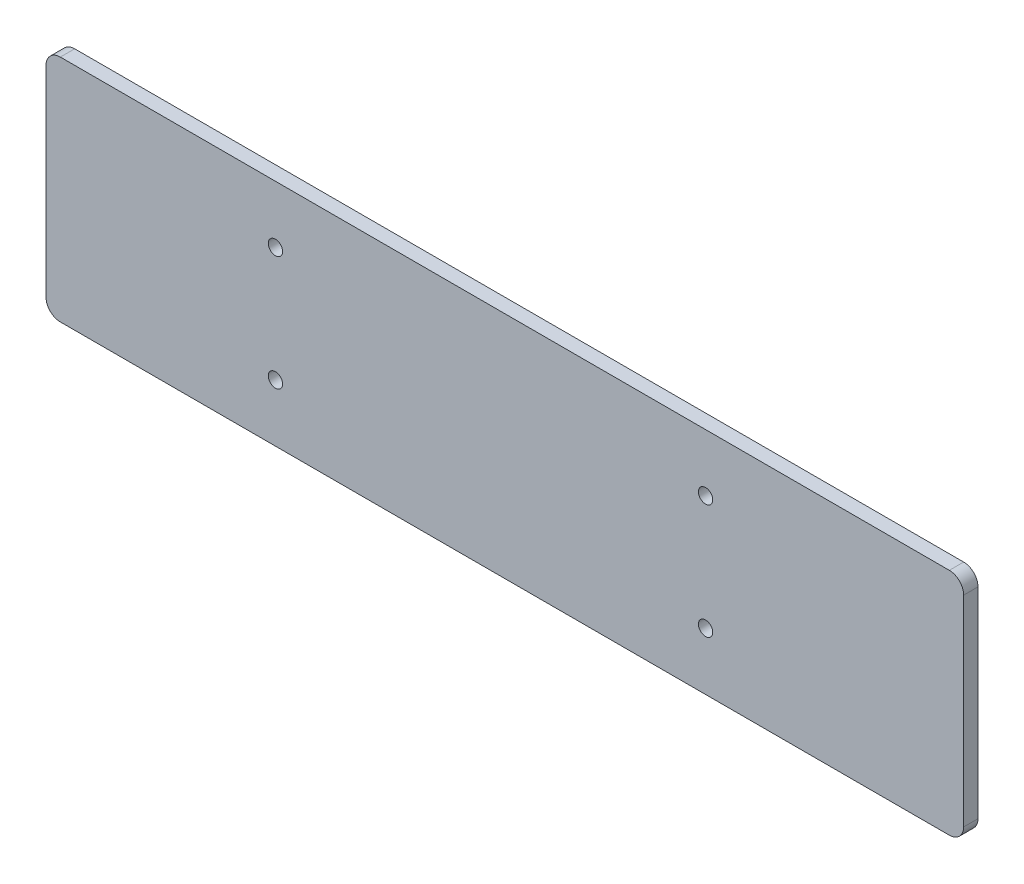
ISO-10303-21;
HEADER;
FILE_DESCRIPTION(('STEP AP214'),'2;1');
FILE_NAME('part.step','',(''),(''),'','','');
FILE_SCHEMA(('AUTOMOTIVE_DESIGN { 1 0 10303 214 1 1 1 1 }'));
ENDSEC;
DATA;
#1=APPLICATION_CONTEXT('core data for automotive mechanical design processes');
#2=APPLICATION_PROTOCOL_DEFINITION('international standard','automotive_design',2000,#1);
#3=PRODUCT_CONTEXT('',#1,'mechanical');
#4=PRODUCT('Part','Part','',(#3));
#5=PRODUCT_RELATED_PRODUCT_CATEGORY('part','',(#4));
#6=PRODUCT_DEFINITION_FORMATION('','',#4);
#7=PRODUCT_DEFINITION_CONTEXT('part definition',#1,'design');
#8=PRODUCT_DEFINITION('design','',#6,#7);
#9=PRODUCT_DEFINITION_SHAPE('','',#8);
#10=(LENGTH_UNIT() NAMED_UNIT(*) SI_UNIT(.MILLI.,.METRE.));
#11=(NAMED_UNIT(*) PLANE_ANGLE_UNIT() SI_UNIT($,.RADIAN.));
#12=(NAMED_UNIT(*) SI_UNIT($,.STERADIAN.) SOLID_ANGLE_UNIT());
#13=UNCERTAINTY_MEASURE_WITH_UNIT(LENGTH_MEASURE(1.E-05),#10,'distance_accuracy_value','');
#14=(GEOMETRIC_REPRESENTATION_CONTEXT(3) GLOBAL_UNCERTAINTY_ASSIGNED_CONTEXT((#13)) GLOBAL_UNIT_ASSIGNED_CONTEXT((#10,
#11,#12)) REPRESENTATION_CONTEXT('',''));
#15=CARTESIAN_POINT('',(0.,0.,0.));
#16=DIRECTION('',(0.,0.,1.));
#17=DIRECTION('',(1.,0.,0.));
#18=AXIS2_PLACEMENT_3D('',#15,#16,#17);
#19=CARTESIAN_POINT('',(0.,0.,5.));
#20=DIRECTION('',(0.,0.,1.));
#21=DIRECTION('',(1.,0.,0.));
#22=AXIS2_PLACEMENT_3D('',#19,#20,#21);
#23=PLANE('',#22);
#24=CARTESIAN_POINT('',(20.,20.,5.));
#25=DIRECTION('',(0.,0.,1.));
#26=DIRECTION('',(1.,0.,0.));
#27=AXIS2_PLACEMENT_3D('',#24,#25,#26);
#28=CIRCLE('',#27,2.49999999999999);
#29=CARTESIAN_POINT('',(22.5,20.,5.));
#30=VERTEX_POINT('',#29);
#31=EDGE_CURVE('E191',#30,#30,#28,.T.);
#32=ORIENTED_EDGE('',*,*,#31,.F.);
#33=EDGE_LOOP('',(#32));
#34=FACE_BOUND('',#33,.T.);
#35=CARTESIAN_POINT('',(-130.,-20.,5.));
#36=DIRECTION('',(0.,0.,1.));
#37=DIRECTION('',(1.,0.,0.));
#38=AXIS2_PLACEMENT_3D('',#35,#36,#37);
#39=CIRCLE('',#38,2.5);
#40=CARTESIAN_POINT('',(-127.5,-20.,5.));
#41=VERTEX_POINT('',#40);
#42=EDGE_CURVE('E134',#41,#41,#39,.T.);
#43=ORIENTED_EDGE('',*,*,#42,.F.);
#44=EDGE_LOOP('',(#43));
#45=FACE_BOUND('',#44,.T.);
#46=DIRECTION('',(0.,-1.,0.));
#47=VECTOR('',#46,1.);
#48=CARTESIAN_POINT('',(-210.,-40.,5.));
#49=LINE('',#48,#47);
#50=CARTESIAN_POINT('',(-210.,35.,5.));
#51=VERTEX_POINT('',#50);
#52=CARTESIAN_POINT('',(-210.,-35.,5.));
#53=VERTEX_POINT('',#52);
#54=EDGE_CURVE('E139',#51,#53,#49,.T.);
#55=ORIENTED_EDGE('',*,*,#54,.T.);
#56=CARTESIAN_POINT('',(-205.,-35.,5.));
#57=DIRECTION('',(0.,0.,1.));
#58=DIRECTION('',(1.,0.,0.));
#59=AXIS2_PLACEMENT_3D('',#56,#57,#58);
#60=CIRCLE('',#59,5.);
#61=CARTESIAN_POINT('',(-205.,-40.,5.));
#62=VERTEX_POINT('',#61);
#63=EDGE_CURVE('E153',#53,#62,#60,.T.);
#64=ORIENTED_EDGE('',*,*,#63,.T.);
#65=DIRECTION('',(1.,0.,0.));
#66=VECTOR('',#65,1.);
#67=CARTESIAN_POINT('',(110.,-40.,5.));
#68=LINE('',#67,#66);
#69=CARTESIAN_POINT('',(105.,-40.,5.));
#70=VERTEX_POINT('',#69);
#71=EDGE_CURVE('E120',#62,#70,#68,.T.);
#72=ORIENTED_EDGE('',*,*,#71,.T.);
#73=CARTESIAN_POINT('',(105.,-35.,5.));
#74=DIRECTION('',(0.,0.,1.));
#75=DIRECTION('',(1.,0.,0.));
#76=AXIS2_PLACEMENT_3D('',#73,#74,#75);
#77=CIRCLE('',#76,5.);
#78=CARTESIAN_POINT('',(110.,-35.,5.));
#79=VERTEX_POINT('',#78);
#80=EDGE_CURVE('E149',#70,#79,#77,.T.);
#81=ORIENTED_EDGE('',*,*,#80,.T.);
#82=DIRECTION('',(0.,1.,0.));
#83=VECTOR('',#82,1.);
#84=CARTESIAN_POINT('',(110.,-40.,5.));
#85=LINE('',#84,#83);
#86=CARTESIAN_POINT('',(110.,35.,5.));
#87=VERTEX_POINT('',#86);
#88=EDGE_CURVE('E162',#79,#87,#85,.T.);
#89=ORIENTED_EDGE('',*,*,#88,.T.);
#90=CARTESIAN_POINT('',(105.,35.,5.));
#91=DIRECTION('',(0.,0.,1.));
#92=DIRECTION('',(1.,0.,0.));
#93=AXIS2_PLACEMENT_3D('',#90,#91,#92);
#94=CIRCLE('',#93,5.);
#95=CARTESIAN_POINT('',(105.,40.,5.));
#96=VERTEX_POINT('',#95);
#97=EDGE_CURVE('E55',#87,#96,#94,.T.);
#98=ORIENTED_EDGE('',*,*,#97,.T.);
#99=DIRECTION('',(-1.,0.,0.));
#100=VECTOR('',#99,1.);
#101=CARTESIAN_POINT('',(110.,40.,5.));
#102=LINE('',#101,#100);
#103=CARTESIAN_POINT('',(-205.,40.,5.));
#104=VERTEX_POINT('',#103);
#105=EDGE_CURVE('E140',#96,#104,#102,.T.);
#106=ORIENTED_EDGE('',*,*,#105,.T.);
#107=CARTESIAN_POINT('',(-205.,35.,5.));
#108=DIRECTION('',(0.,0.,1.));
#109=DIRECTION('',(1.,0.,0.));
#110=AXIS2_PLACEMENT_3D('',#107,#108,#109);
#111=CIRCLE('',#110,5.);
#112=EDGE_CURVE('E151',#104,#51,#111,.T.);
#113=ORIENTED_EDGE('',*,*,#112,.T.);
#114=EDGE_LOOP('',(#55,#64,#72,#81,#89,#98,#106,#113));
#115=FACE_BOUND('',#114,.T.);
#116=CARTESIAN_POINT('',(-130.,20.,5.));
#117=DIRECTION('',(0.,0.,1.));
#118=DIRECTION('',(1.,0.,0.));
#119=AXIS2_PLACEMENT_3D('',#116,#117,#118);
#120=CIRCLE('',#119,2.5);
#121=CARTESIAN_POINT('',(-127.5,20.,5.));
#122=VERTEX_POINT('',#121);
#123=EDGE_CURVE('E185',#122,#122,#120,.T.);
#124=ORIENTED_EDGE('',*,*,#123,.F.);
#125=EDGE_LOOP('',(#124));
#126=FACE_BOUND('',#125,.T.);
#127=CARTESIAN_POINT('',(20.,-20.,5.));
#128=DIRECTION('',(0.,0.,1.));
#129=DIRECTION('',(1.,0.,0.));
#130=AXIS2_PLACEMENT_3D('',#127,#128,#129);
#131=CIRCLE('',#130,2.49999999999999);
#132=CARTESIAN_POINT('',(22.5,-20.,5.));
#133=VERTEX_POINT('',#132);
#134=EDGE_CURVE('E197',#133,#133,#131,.T.);
#135=ORIENTED_EDGE('',*,*,#134,.F.);
#136=EDGE_LOOP('',(#135));
#137=FACE_BOUND('',#136,.T.);
#138=ADVANCED_FACE('F33',(#34,#45,#115,#126,#137),#23,.T.);
#139=CARTESIAN_POINT('',(0.,0.,0.));
#140=DIRECTION('',(0.,0.,1.));
#141=DIRECTION('',(1.,0.,0.));
#142=AXIS2_PLACEMENT_3D('',#139,#140,#141);
#143=PLANE('',#142);
#144=DIRECTION('',(1.,0.,0.));
#145=VECTOR('',#144,1.);
#146=CARTESIAN_POINT('',(110.,-40.,0.));
#147=LINE('',#146,#145);
#148=CARTESIAN_POINT('',(-205.,-40.,0.));
#149=VERTEX_POINT('',#148);
#150=CARTESIAN_POINT('',(105.,-40.,0.));
#151=VERTEX_POINT('',#150);
#152=EDGE_CURVE('E117',#149,#151,#147,.T.);
#153=ORIENTED_EDGE('',*,*,#152,.F.);
#154=CARTESIAN_POINT('',(-205.,-35.,0.));
#155=DIRECTION('',(0.,0.,1.));
#156=DIRECTION('',(1.,0.,0.));
#157=AXIS2_PLACEMENT_3D('',#154,#155,#156);
#158=CIRCLE('',#157,5.);
#159=CARTESIAN_POINT('',(-210.,-35.,0.));
#160=VERTEX_POINT('',#159);
#161=EDGE_CURVE('E100',#149,#160,#158,.F.);
#162=ORIENTED_EDGE('',*,*,#161,.T.);
#163=DIRECTION('',(0.,-1.,0.));
#164=VECTOR('',#163,1.);
#165=CARTESIAN_POINT('',(-210.,-40.,0.));
#166=LINE('',#165,#164);
#167=CARTESIAN_POINT('',(-210.,35.,0.));
#168=VERTEX_POINT('',#167);
#169=EDGE_CURVE('E129',#168,#160,#166,.T.);
#170=ORIENTED_EDGE('',*,*,#169,.F.);
#171=CARTESIAN_POINT('',(-205.,35.,0.));
#172=DIRECTION('',(0.,0.,1.));
#173=DIRECTION('',(1.,0.,0.));
#174=AXIS2_PLACEMENT_3D('',#171,#172,#173);
#175=CIRCLE('',#174,5.);
#176=CARTESIAN_POINT('',(-205.,40.,0.));
#177=VERTEX_POINT('',#176);
#178=EDGE_CURVE('E111',#168,#177,#175,.F.);
#179=ORIENTED_EDGE('',*,*,#178,.T.);
#180=DIRECTION('',(-1.,0.,0.));
#181=VECTOR('',#180,1.);
#182=CARTESIAN_POINT('',(110.,40.,0.));
#183=LINE('',#182,#181);
#184=CARTESIAN_POINT('',(105.,40.,0.));
#185=VERTEX_POINT('',#184);
#186=EDGE_CURVE('E132',#185,#177,#183,.T.);
#187=ORIENTED_EDGE('',*,*,#186,.F.);
#188=CARTESIAN_POINT('',(105.,35.,0.));
#189=DIRECTION('',(0.,0.,1.));
#190=DIRECTION('',(1.,0.,0.));
#191=AXIS2_PLACEMENT_3D('',#188,#189,#190);
#192=CIRCLE('',#191,5.);
#193=CARTESIAN_POINT('',(110.,35.,0.));
#194=VERTEX_POINT('',#193);
#195=EDGE_CURVE('E121',#185,#194,#192,.F.);
#196=ORIENTED_EDGE('',*,*,#195,.T.);
#197=DIRECTION('',(0.,1.,0.));
#198=VECTOR('',#197,1.);
#199=CARTESIAN_POINT('',(110.,-40.,0.));
#200=LINE('',#199,#198);
#201=CARTESIAN_POINT('',(110.,-35.,0.));
#202=VERTEX_POINT('',#201);
#203=EDGE_CURVE('E128',#202,#194,#200,.T.);
#204=ORIENTED_EDGE('',*,*,#203,.F.);
#205=CARTESIAN_POINT('',(105.,-35.,0.));
#206=DIRECTION('',(0.,0.,1.));
#207=DIRECTION('',(1.,0.,0.));
#208=AXIS2_PLACEMENT_3D('',#205,#206,#207);
#209=CIRCLE('',#208,5.);
#210=EDGE_CURVE('E127',#202,#151,#209,.F.);
#211=ORIENTED_EDGE('',*,*,#210,.T.);
#212=EDGE_LOOP('',(#153,#162,#170,#179,#187,#196,#204,#211));
#213=FACE_BOUND('',#212,.T.);
#214=CARTESIAN_POINT('',(-130.,-20.,0.));
#215=DIRECTION('',(0.,0.,1.));
#216=DIRECTION('',(1.,0.,0.));
#217=AXIS2_PLACEMENT_3D('',#214,#215,#216);
#218=CIRCLE('',#217,2.5);
#219=CARTESIAN_POINT('',(-127.5,-20.,0.));
#220=VERTEX_POINT('',#219);
#221=EDGE_CURVE('E182',#220,#220,#218,.T.);
#222=ORIENTED_EDGE('',*,*,#221,.T.);
#223=EDGE_LOOP('',(#222));
#224=FACE_BOUND('',#223,.T.);
#225=CARTESIAN_POINT('',(-130.,20.,0.));
#226=DIRECTION('',(0.,0.,1.));
#227=DIRECTION('',(1.,0.,0.));
#228=AXIS2_PLACEMENT_3D('',#225,#226,#227);
#229=CIRCLE('',#228,2.5);
#230=CARTESIAN_POINT('',(-127.5,20.,0.));
#231=VERTEX_POINT('',#230);
#232=EDGE_CURVE('E188',#231,#231,#229,.T.);
#233=ORIENTED_EDGE('',*,*,#232,.T.);
#234=EDGE_LOOP('',(#233));
#235=FACE_BOUND('',#234,.T.);
#236=CARTESIAN_POINT('',(20.,20.,0.));
#237=DIRECTION('',(0.,0.,1.));
#238=DIRECTION('',(1.,0.,0.));
#239=AXIS2_PLACEMENT_3D('',#236,#237,#238);
#240=CIRCLE('',#239,2.49999999999999);
#241=CARTESIAN_POINT('',(22.5,20.,0.));
#242=VERTEX_POINT('',#241);
#243=EDGE_CURVE('E194',#242,#242,#240,.T.);
#244=ORIENTED_EDGE('',*,*,#243,.T.);
#245=EDGE_LOOP('',(#244));
#246=FACE_BOUND('',#245,.T.);
#247=CARTESIAN_POINT('',(20.,-20.,0.));
#248=DIRECTION('',(0.,0.,1.));
#249=DIRECTION('',(1.,0.,0.));
#250=AXIS2_PLACEMENT_3D('',#247,#248,#249);
#251=CIRCLE('',#250,2.49999999999999);
#252=CARTESIAN_POINT('',(22.5,-20.,0.));
#253=VERTEX_POINT('',#252);
#254=EDGE_CURVE('E200',#253,#253,#251,.T.);
#255=ORIENTED_EDGE('',*,*,#254,.T.);
#256=EDGE_LOOP('',(#255));
#257=FACE_BOUND('',#256,.T.);
#258=ADVANCED_FACE('F124',(#213,#224,#235,#246,#257),#143,.F.);
#259=CARTESIAN_POINT('',(-210.,-40.,5.));
#260=DIRECTION('',(1.,0.,0.));
#261=DIRECTION('',(0.,0.,-1.));
#262=AXIS2_PLACEMENT_3D('',#259,#260,#261);
#263=PLANE('',#262);
#264=ORIENTED_EDGE('',*,*,#169,.T.);
#265=DIRECTION('',(0.,0.,-1.));
#266=VECTOR('',#265,1.);
#267=CARTESIAN_POINT('',(-210.,-35.,5.));
#268=LINE('',#267,#266);
#269=EDGE_CURVE('E105',#160,#53,#268,.F.);
#270=ORIENTED_EDGE('',*,*,#269,.T.);
#271=ORIENTED_EDGE('',*,*,#54,.F.);
#272=DIRECTION('',(0.,0.,-1.));
#273=VECTOR('',#272,1.);
#274=CARTESIAN_POINT('',(-210.,35.,5.));
#275=LINE('',#274,#273);
#276=EDGE_CURVE('E110',#51,#168,#275,.T.);
#277=ORIENTED_EDGE('',*,*,#276,.T.);
#278=EDGE_LOOP('',(#264,#270,#271,#277));
#279=FACE_BOUND('',#278,.T.);
#280=ADVANCED_FACE('F178',(#279),#263,.F.);
#281=CARTESIAN_POINT('',(110.,-40.,5.));
#282=DIRECTION('',(0.,1.,0.));
#283=DIRECTION('',(-1.,0.,0.));
#284=AXIS2_PLACEMENT_3D('',#281,#282,#283);
#285=PLANE('',#284);
#286=ORIENTED_EDGE('',*,*,#71,.F.);
#287=DIRECTION('',(0.,0.,-1.));
#288=VECTOR('',#287,1.);
#289=CARTESIAN_POINT('',(-205.,-40.,5.));
#290=LINE('',#289,#288);
#291=EDGE_CURVE('E104',#62,#149,#290,.T.);
#292=ORIENTED_EDGE('',*,*,#291,.T.);
#293=ORIENTED_EDGE('',*,*,#152,.T.);
#294=DIRECTION('',(0.,0.,-1.));
#295=VECTOR('',#294,1.);
#296=CARTESIAN_POINT('',(105.,-40.,5.));
#297=LINE('',#296,#295);
#298=EDGE_CURVE('E122',#151,#70,#297,.F.);
#299=ORIENTED_EDGE('',*,*,#298,.T.);
#300=EDGE_LOOP('',(#286,#292,#293,#299));
#301=FACE_BOUND('',#300,.T.);
#302=ADVANCED_FACE('F116',(#301),#285,.F.);
#303=CARTESIAN_POINT('',(110.,-40.,5.));
#304=DIRECTION('',(-1.,0.,0.));
#305=DIRECTION('',(0.,0.,1.));
#306=AXIS2_PLACEMENT_3D('',#303,#304,#305);
#307=PLANE('',#306);
#308=ORIENTED_EDGE('',*,*,#88,.F.);
#309=DIRECTION('',(0.,0.,-1.));
#310=VECTOR('',#309,1.);
#311=CARTESIAN_POINT('',(110.,-35.,5.));
#312=LINE('',#311,#310);
#313=EDGE_CURVE('E11',#79,#202,#312,.T.);
#314=ORIENTED_EDGE('',*,*,#313,.T.);
#315=ORIENTED_EDGE('',*,*,#203,.T.);
#316=DIRECTION('',(0.,0.,-1.));
#317=VECTOR('',#316,1.);
#318=CARTESIAN_POINT('',(110.,35.,5.));
#319=LINE('',#318,#317);
#320=EDGE_CURVE('E41',#194,#87,#319,.F.);
#321=ORIENTED_EDGE('',*,*,#320,.T.);
#322=EDGE_LOOP('',(#308,#314,#315,#321));
#323=FACE_BOUND('',#322,.T.);
#324=ADVANCED_FACE('F161',(#323),#307,.F.);
#325=CARTESIAN_POINT('',(110.,40.,5.));
#326=DIRECTION('',(0.,-1.,0.));
#327=DIRECTION('',(1.,0.,0.));
#328=AXIS2_PLACEMENT_3D('',#325,#326,#327);
#329=PLANE('',#328);
#330=ORIENTED_EDGE('',*,*,#186,.T.);
#331=DIRECTION('',(0.,0.,-1.));
#332=VECTOR('',#331,1.);
#333=CARTESIAN_POINT('',(-205.,40.,5.));
#334=LINE('',#333,#332);
#335=EDGE_CURVE('E48',#177,#104,#334,.F.);
#336=ORIENTED_EDGE('',*,*,#335,.T.);
#337=ORIENTED_EDGE('',*,*,#105,.F.);
#338=DIRECTION('',(0.,0.,-1.));
#339=VECTOR('',#338,1.);
#340=CARTESIAN_POINT('',(105.,40.,5.));
#341=LINE('',#340,#339);
#342=EDGE_CURVE('E155',#96,#185,#341,.T.);
#343=ORIENTED_EDGE('',*,*,#342,.T.);
#344=EDGE_LOOP('',(#330,#336,#337,#343));
#345=FACE_BOUND('',#344,.T.);
#346=ADVANCED_FACE('F171',(#345),#329,.F.);
#347=CARTESIAN_POINT('',(-130.,-20.,5.));
#348=DIRECTION('',(0.,0.,-1.));
#349=DIRECTION('',(-1.,0.,0.));
#350=AXIS2_PLACEMENT_3D('',#347,#348,#349);
#351=CYLINDRICAL_SURFACE('',#350,2.5);
#352=ORIENTED_EDGE('',*,*,#42,.T.);
#353=EDGE_LOOP('',(#352));
#354=FACE_BOUND('',#353,.T.);
#355=ORIENTED_EDGE('',*,*,#221,.F.);
#356=EDGE_LOOP('',(#355));
#357=FACE_BOUND('',#356,.T.);
#358=ADVANCED_FACE('F219',(#354,#357),#351,.F.);
#359=CARTESIAN_POINT('',(-130.,20.,5.));
#360=DIRECTION('',(0.,0.,-1.));
#361=DIRECTION('',(-1.,0.,0.));
#362=AXIS2_PLACEMENT_3D('',#359,#360,#361);
#363=CYLINDRICAL_SURFACE('',#362,2.5);
#364=ORIENTED_EDGE('',*,*,#123,.T.);
#365=EDGE_LOOP('',(#364));
#366=FACE_BOUND('',#365,.T.);
#367=ORIENTED_EDGE('',*,*,#232,.F.);
#368=EDGE_LOOP('',(#367));
#369=FACE_BOUND('',#368,.T.);
#370=ADVANCED_FACE('F311',(#366,#369),#363,.F.);
#371=CARTESIAN_POINT('',(20.,20.,5.));
#372=DIRECTION('',(0.,0.,-1.));
#373=DIRECTION('',(-1.,0.,0.));
#374=AXIS2_PLACEMENT_3D('',#371,#372,#373);
#375=CYLINDRICAL_SURFACE('',#374,2.49999999999999);
#376=ORIENTED_EDGE('',*,*,#31,.T.);
#377=EDGE_LOOP('',(#376));
#378=FACE_BOUND('',#377,.T.);
#379=ORIENTED_EDGE('',*,*,#243,.F.);
#380=EDGE_LOOP('',(#379));
#381=FACE_BOUND('',#380,.T.);
#382=ADVANCED_FACE('F302',(#378,#381),#375,.F.);
#383=CARTESIAN_POINT('',(20.,-20.,5.));
#384=DIRECTION('',(0.,0.,-1.));
#385=DIRECTION('',(-1.,0.,0.));
#386=AXIS2_PLACEMENT_3D('',#383,#384,#385);
#387=CYLINDRICAL_SURFACE('',#386,2.49999999999999);
#388=ORIENTED_EDGE('',*,*,#134,.T.);
#389=EDGE_LOOP('',(#388));
#390=FACE_BOUND('',#389,.T.);
#391=ORIENTED_EDGE('',*,*,#254,.F.);
#392=EDGE_LOOP('',(#391));
#393=FACE_BOUND('',#392,.T.);
#394=ADVANCED_FACE('F206',(#390,#393),#387,.F.);
#395=CARTESIAN_POINT('',(-205.,-35.,5.));
#396=DIRECTION('',(0.,0.,-1.));
#397=DIRECTION('',(-1.,0.,0.));
#398=AXIS2_PLACEMENT_3D('',#395,#396,#397);
#399=CYLINDRICAL_SURFACE('',#398,5.);
#400=ORIENTED_EDGE('',*,*,#63,.F.);
#401=ORIENTED_EDGE('',*,*,#269,.F.);
#402=ORIENTED_EDGE('',*,*,#161,.F.);
#403=ORIENTED_EDGE('',*,*,#291,.F.);
#404=EDGE_LOOP('',(#400,#401,#402,#403));
#405=FACE_BOUND('',#404,.T.);
#406=ADVANCED_FACE('F103',(#405),#399,.T.);
#407=CARTESIAN_POINT('',(-205.,35.,5.));
#408=DIRECTION('',(0.,0.,-1.));
#409=DIRECTION('',(-1.,0.,0.));
#410=AXIS2_PLACEMENT_3D('',#407,#408,#409);
#411=CYLINDRICAL_SURFACE('',#410,5.);
#412=ORIENTED_EDGE('',*,*,#112,.F.);
#413=ORIENTED_EDGE('',*,*,#335,.F.);
#414=ORIENTED_EDGE('',*,*,#178,.F.);
#415=ORIENTED_EDGE('',*,*,#276,.F.);
#416=EDGE_LOOP('',(#412,#413,#414,#415));
#417=FACE_BOUND('',#416,.T.);
#418=ADVANCED_FACE('F175',(#417),#411,.T.);
#419=CARTESIAN_POINT('',(105.,-35.,5.));
#420=DIRECTION('',(0.,0.,-1.));
#421=DIRECTION('',(-1.,0.,0.));
#422=AXIS2_PLACEMENT_3D('',#419,#420,#421);
#423=CYLINDRICAL_SURFACE('',#422,5.);
#424=ORIENTED_EDGE('',*,*,#80,.F.);
#425=ORIENTED_EDGE('',*,*,#298,.F.);
#426=ORIENTED_EDGE('',*,*,#210,.F.);
#427=ORIENTED_EDGE('',*,*,#313,.F.);
#428=EDGE_LOOP('',(#424,#425,#426,#427));
#429=FACE_BOUND('',#428,.T.);
#430=ADVANCED_FACE('F233',(#429),#423,.T.);
#431=CARTESIAN_POINT('',(105.,35.,5.));
#432=DIRECTION('',(0.,0.,-1.));
#433=DIRECTION('',(-1.,0.,0.));
#434=AXIS2_PLACEMENT_3D('',#431,#432,#433);
#435=CYLINDRICAL_SURFACE('',#434,5.);
#436=ORIENTED_EDGE('',*,*,#97,.F.);
#437=ORIENTED_EDGE('',*,*,#320,.F.);
#438=ORIENTED_EDGE('',*,*,#195,.F.);
#439=ORIENTED_EDGE('',*,*,#342,.F.);
#440=EDGE_LOOP('',(#436,#437,#438,#439));
#441=FACE_BOUND('',#440,.T.);
#442=ADVANCED_FACE('F35',(#441),#435,.T.);
#443=CLOSED_SHELL('',(#138,#258,#280,#302,#324,#346,#358,#370,#382,#394,#406,#418,#430,#442));
#444=MANIFOLD_SOLID_BREP('B2',#443);
#445=ADVANCED_BREP_SHAPE_REPRESENTATION('',(#18,#444),#14);
#446=SHAPE_DEFINITION_REPRESENTATION(#9,#445);
ENDSEC;
END-ISO-10303-21;
